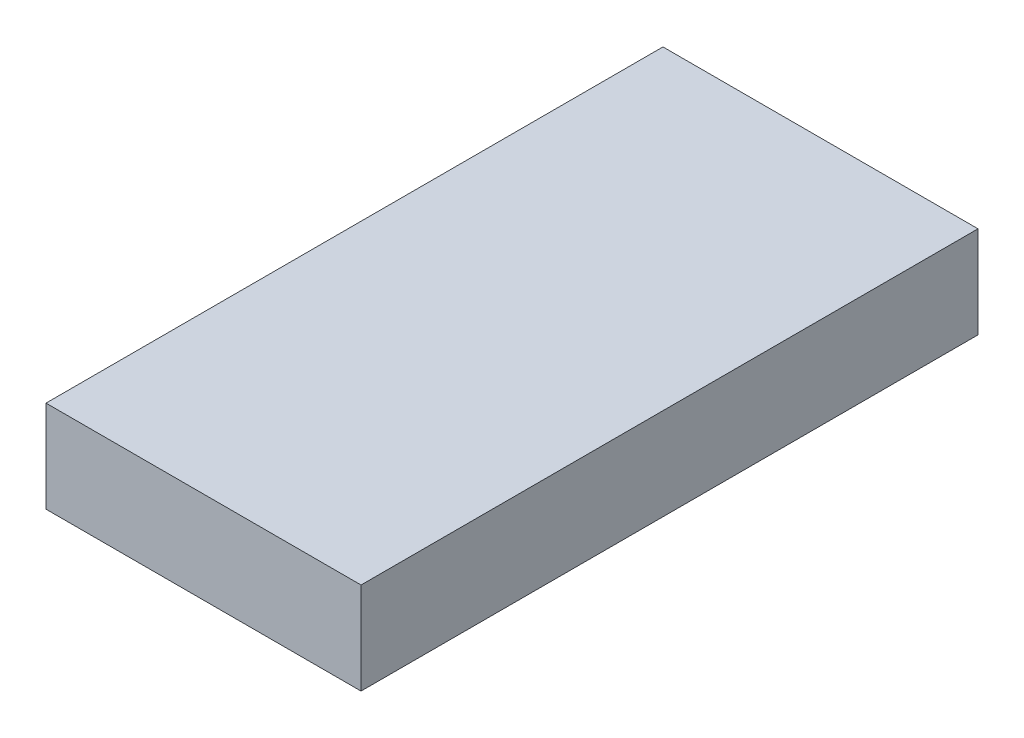
ISO-10303-21;
HEADER;
FILE_DESCRIPTION(('STEP AP214'),'2;1');
FILE_NAME('part.step','',(''),(''),'','','');
FILE_SCHEMA(('AUTOMOTIVE_DESIGN { 1 0 10303 214 1 1 1 1 }'));
ENDSEC;
DATA;
#1=APPLICATION_CONTEXT('core data for automotive mechanical design processes');
#2=APPLICATION_PROTOCOL_DEFINITION('international standard','automotive_design',2000,#1);
#3=PRODUCT_CONTEXT('',#1,'mechanical');
#4=PRODUCT('Part','Part','',(#3));
#5=PRODUCT_RELATED_PRODUCT_CATEGORY('part','',(#4));
#6=PRODUCT_DEFINITION_FORMATION('','',#4);
#7=PRODUCT_DEFINITION_CONTEXT('part definition',#1,'design');
#8=PRODUCT_DEFINITION('design','',#6,#7);
#9=PRODUCT_DEFINITION_SHAPE('','',#8);
#10=(LENGTH_UNIT() NAMED_UNIT(*) SI_UNIT(.MILLI.,.METRE.));
#11=(NAMED_UNIT(*) PLANE_ANGLE_UNIT() SI_UNIT($,.RADIAN.));
#12=(NAMED_UNIT(*) SI_UNIT($,.STERADIAN.) SOLID_ANGLE_UNIT());
#13=UNCERTAINTY_MEASURE_WITH_UNIT(LENGTH_MEASURE(1.E-05),#10,'distance_accuracy_value','');
#14=(GEOMETRIC_REPRESENTATION_CONTEXT(3) GLOBAL_UNCERTAINTY_ASSIGNED_CONTEXT((#13)) GLOBAL_UNIT_ASSIGNED_CONTEXT((#10,
#11,#12)) REPRESENTATION_CONTEXT('',''));
#15=CARTESIAN_POINT('',(0.,0.,0.));
#16=DIRECTION('',(0.,0.,1.));
#17=DIRECTION('',(1.,0.,0.));
#18=AXIS2_PLACEMENT_3D('',#15,#16,#17);
#19=CARTESIAN_POINT('',(60.96,17.78,238.76));
#20=DIRECTION('',(-1.,0.,0.));
#21=DIRECTION('',(0.,0.,1.));
#22=AXIS2_PLACEMENT_3D('',#19,#20,#21);
#23=PLANE('',#22);
#24=DIRECTION('',(0.,1.,0.));
#25=VECTOR('',#24,1.);
#26=CARTESIAN_POINT('',(60.96,17.78,0.));
#27=LINE('',#26,#25);
#28=CARTESIAN_POINT('',(60.96,-17.78,0.));
#29=VERTEX_POINT('',#28);
#30=CARTESIAN_POINT('',(60.96,17.78,0.));
#31=VERTEX_POINT('',#30);
#32=EDGE_CURVE('E96',#29,#31,#27,.T.);
#33=ORIENTED_EDGE('',*,*,#32,.T.);
#34=DIRECTION('',(0.,0.,-1.));
#35=VECTOR('',#34,1.);
#36=CARTESIAN_POINT('',(60.96,17.78,238.76));
#37=LINE('',#36,#35);
#38=CARTESIAN_POINT('',(60.96,17.78,238.76));
#39=VERTEX_POINT('',#38);
#40=EDGE_CURVE('E11',#39,#31,#37,.T.);
#41=ORIENTED_EDGE('',*,*,#40,.F.);
#42=DIRECTION('',(0.,1.,0.));
#43=VECTOR('',#42,1.);
#44=CARTESIAN_POINT('',(60.96,17.78,238.76));
#45=LINE('',#44,#43);
#46=CARTESIAN_POINT('',(60.96,-17.78,238.76));
#47=VERTEX_POINT('',#46);
#48=EDGE_CURVE('E84',#47,#39,#45,.T.);
#49=ORIENTED_EDGE('',*,*,#48,.F.);
#50=DIRECTION('',(0.,0.,-1.));
#51=VECTOR('',#50,1.);
#52=CARTESIAN_POINT('',(60.96,-17.78,238.76));
#53=LINE('',#52,#51);
#54=EDGE_CURVE('E92',#47,#29,#53,.T.);
#55=ORIENTED_EDGE('',*,*,#54,.T.);
#56=EDGE_LOOP('',(#33,#41,#49,#55));
#57=FACE_BOUND('',#56,.T.);
#58=ADVANCED_FACE('F33',(#57),#23,.F.);
#59=CARTESIAN_POINT('',(-60.96,17.78,238.76));
#60=DIRECTION('',(0.,-1.,0.));
#61=DIRECTION('',(0.,0.,-1.));
#62=AXIS2_PLACEMENT_3D('',#59,#60,#61);
#63=PLANE('',#62);
#64=DIRECTION('',(-1.,0.,0.));
#65=VECTOR('',#64,1.);
#66=CARTESIAN_POINT('',(-60.96,17.78,0.));
#67=LINE('',#66,#65);
#68=CARTESIAN_POINT('',(-60.96,17.78,0.));
#69=VERTEX_POINT('',#68);
#70=EDGE_CURVE('E88',#31,#69,#67,.T.);
#71=ORIENTED_EDGE('',*,*,#70,.T.);
#72=DIRECTION('',(0.,0.,-1.));
#73=VECTOR('',#72,1.);
#74=CARTESIAN_POINT('',(-60.96,17.78,238.76));
#75=LINE('',#74,#73);
#76=CARTESIAN_POINT('',(-60.96,17.78,238.76));
#77=VERTEX_POINT('',#76);
#78=EDGE_CURVE('E41',#77,#69,#75,.T.);
#79=ORIENTED_EDGE('',*,*,#78,.F.);
#80=DIRECTION('',(-1.,0.,0.));
#81=VECTOR('',#80,1.);
#82=CARTESIAN_POINT('',(-60.96,17.78,238.76));
#83=LINE('',#82,#81);
#84=EDGE_CURVE('E79',#39,#77,#83,.T.);
#85=ORIENTED_EDGE('',*,*,#84,.F.);
#86=ORIENTED_EDGE('',*,*,#40,.T.);
#87=EDGE_LOOP('',(#71,#79,#85,#86));
#88=FACE_BOUND('',#87,.T.);
#89=ADVANCED_FACE('F87',(#88),#63,.F.);
#90=CARTESIAN_POINT('',(-60.96,17.78,238.76));
#91=DIRECTION('',(1.,0.,0.));
#92=DIRECTION('',(0.,1.,0.));
#93=AXIS2_PLACEMENT_3D('',#90,#91,#92);
#94=PLANE('',#93);
#95=DIRECTION('',(0.,-1.,0.));
#96=VECTOR('',#95,1.);
#97=CARTESIAN_POINT('',(-60.96,17.78,0.));
#98=LINE('',#97,#96);
#99=CARTESIAN_POINT('',(-60.96,-17.78,0.));
#100=VERTEX_POINT('',#99);
#101=EDGE_CURVE('E66',#69,#100,#98,.T.);
#102=ORIENTED_EDGE('',*,*,#101,.T.);
#103=DIRECTION('',(0.,0.,-1.));
#104=VECTOR('',#103,1.);
#105=CARTESIAN_POINT('',(-60.96,-17.78,238.76));
#106=LINE('',#105,#104);
#107=CARTESIAN_POINT('',(-60.96,-17.78,238.76));
#108=VERTEX_POINT('',#107);
#109=EDGE_CURVE('E89',#108,#100,#106,.T.);
#110=ORIENTED_EDGE('',*,*,#109,.F.);
#111=DIRECTION('',(0.,-1.,0.));
#112=VECTOR('',#111,1.);
#113=CARTESIAN_POINT('',(-60.96,17.78,238.76));
#114=LINE('',#113,#112);
#115=EDGE_CURVE('E82',#77,#108,#114,.T.);
#116=ORIENTED_EDGE('',*,*,#115,.F.);
#117=ORIENTED_EDGE('',*,*,#78,.T.);
#118=EDGE_LOOP('',(#102,#110,#116,#117));
#119=FACE_BOUND('',#118,.T.);
#120=ADVANCED_FACE('F90',(#119),#94,.F.);
#121=CARTESIAN_POINT('',(-60.96,-17.78,238.76));
#122=DIRECTION('',(0.,1.,0.));
#123=DIRECTION('',(0.,0.,1.));
#124=AXIS2_PLACEMENT_3D('',#121,#122,#123);
#125=PLANE('',#124);
#126=DIRECTION('',(1.,0.,0.));
#127=VECTOR('',#126,1.);
#128=CARTESIAN_POINT('',(-60.96,-17.78,0.));
#129=LINE('',#128,#127);
#130=EDGE_CURVE('E72',#100,#29,#129,.T.);
#131=ORIENTED_EDGE('',*,*,#130,.T.);
#132=ORIENTED_EDGE('',*,*,#54,.F.);
#133=DIRECTION('',(1.,0.,0.));
#134=VECTOR('',#133,1.);
#135=CARTESIAN_POINT('',(-60.96,-17.78,238.76));
#136=LINE('',#135,#134);
#137=EDGE_CURVE('E49',#108,#47,#136,.T.);
#138=ORIENTED_EDGE('',*,*,#137,.F.);
#139=ORIENTED_EDGE('',*,*,#109,.T.);
#140=EDGE_LOOP('',(#131,#132,#138,#139));
#141=FACE_BOUND('',#140,.T.);
#142=ADVANCED_FACE('F103',(#141),#125,.F.);
#143=CARTESIAN_POINT('',(0.,0.,238.76));
#144=DIRECTION('',(0.,0.,1.));
#145=DIRECTION('',(1.,0.,0.));
#146=AXIS2_PLACEMENT_3D('',#143,#144,#145);
#147=PLANE('',#146);
#148=ORIENTED_EDGE('',*,*,#48,.T.);
#149=ORIENTED_EDGE('',*,*,#84,.T.);
#150=ORIENTED_EDGE('',*,*,#115,.T.);
#151=ORIENTED_EDGE('',*,*,#137,.T.);
#152=EDGE_LOOP('',(#148,#149,#150,#151));
#153=FACE_BOUND('',#152,.T.);
#154=ADVANCED_FACE('F80',(#153),#147,.T.);
#155=CARTESIAN_POINT('',(0.,0.,0.));
#156=DIRECTION('',(0.,0.,1.));
#157=DIRECTION('',(1.,0.,0.));
#158=AXIS2_PLACEMENT_3D('',#155,#156,#157);
#159=PLANE('',#158);
#160=ORIENTED_EDGE('',*,*,#32,.F.);
#161=ORIENTED_EDGE('',*,*,#130,.F.);
#162=ORIENTED_EDGE('',*,*,#101,.F.);
#163=ORIENTED_EDGE('',*,*,#70,.F.);
#164=EDGE_LOOP('',(#160,#161,#162,#163));
#165=FACE_BOUND('',#164,.T.);
#166=ADVANCED_FACE('F106',(#165),#159,.F.);
#167=CLOSED_SHELL('',(#58,#89,#120,#142,#154,#166));
#168=MANIFOLD_SOLID_BREP('B2',#167);
#169=ADVANCED_BREP_SHAPE_REPRESENTATION('',(#18,#168),#14);
#170=SHAPE_DEFINITION_REPRESENTATION(#9,#169);
ENDSEC;
END-ISO-10303-21;
